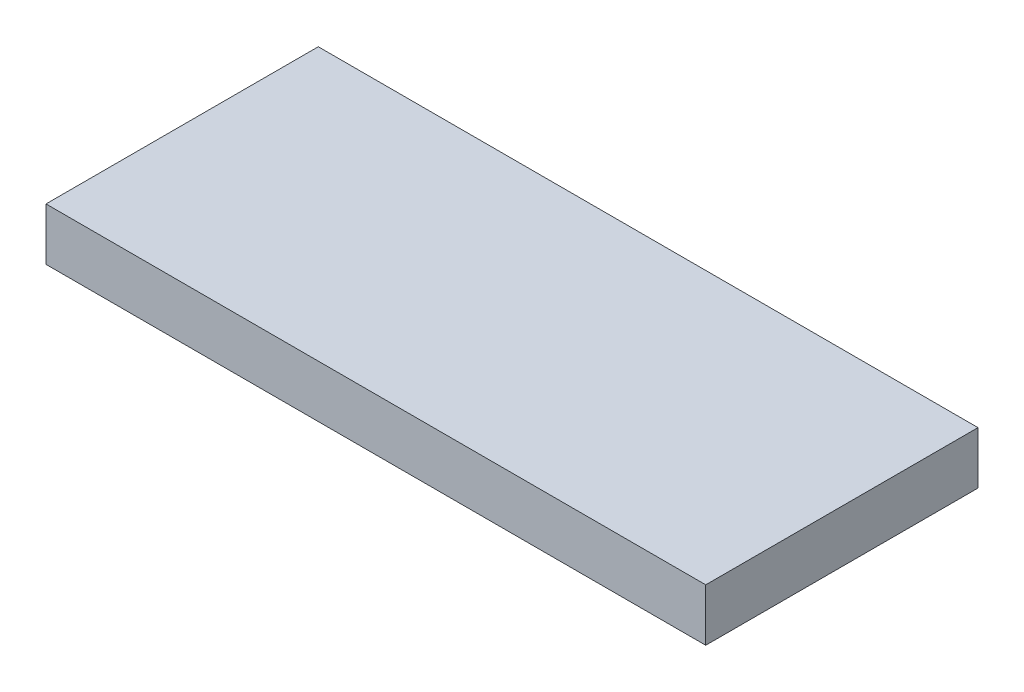
ISO-10303-21;
HEADER;
FILE_DESCRIPTION(('STEP AP214'),'2;1');
FILE_NAME('part.step','',(''),(''),'','','');
FILE_SCHEMA(('AUTOMOTIVE_DESIGN { 1 0 10303 214 1 1 1 1 }'));
ENDSEC;
DATA;
#1=APPLICATION_CONTEXT('core data for automotive mechanical design processes');
#2=APPLICATION_PROTOCOL_DEFINITION('international standard','automotive_design',2000,#1);
#3=PRODUCT_CONTEXT('',#1,'mechanical');
#4=PRODUCT('Part','Part','',(#3));
#5=PRODUCT_RELATED_PRODUCT_CATEGORY('part','',(#4));
#6=PRODUCT_DEFINITION_FORMATION('','',#4);
#7=PRODUCT_DEFINITION_CONTEXT('part definition',#1,'design');
#8=PRODUCT_DEFINITION('design','',#6,#7);
#9=PRODUCT_DEFINITION_SHAPE('','',#8);
#10=(LENGTH_UNIT() NAMED_UNIT(*) SI_UNIT(.MILLI.,.METRE.));
#11=(NAMED_UNIT(*) PLANE_ANGLE_UNIT() SI_UNIT($,.RADIAN.));
#12=(NAMED_UNIT(*) SI_UNIT($,.STERADIAN.) SOLID_ANGLE_UNIT());
#13=UNCERTAINTY_MEASURE_WITH_UNIT(LENGTH_MEASURE(1.E-05),#10,'distance_accuracy_value','');
#14=(GEOMETRIC_REPRESENTATION_CONTEXT(3) GLOBAL_UNCERTAINTY_ASSIGNED_CONTEXT((#13)) GLOBAL_UNIT_ASSIGNED_CONTEXT((#10,
#11,#12)) REPRESENTATION_CONTEXT('',''));
#15=CARTESIAN_POINT('',(0.,0.,0.));
#16=DIRECTION('',(0.,0.,1.));
#17=DIRECTION('',(1.,0.,0.));
#18=AXIS2_PLACEMENT_3D('',#15,#16,#17);
#19=CARTESIAN_POINT('',(0.,5.,0.));
#20=DIRECTION('',(1.,0.,0.));
#21=DIRECTION('',(0.,0.,-1.));
#22=AXIS2_PLACEMENT_3D('',#19,#20,#21);
#23=PLANE('',#22);
#24=DIRECTION('',(0.,0.,1.));
#25=VECTOR('',#24,1.);
#26=CARTESIAN_POINT('',(0.,0.,0.));
#27=LINE('',#26,#25);
#28=CARTESIAN_POINT('',(0.,0.,-26.));
#29=VERTEX_POINT('',#28);
#30=CARTESIAN_POINT('',(0.,0.,0.));
#31=VERTEX_POINT('',#30);
#32=EDGE_CURVE('E106',#29,#31,#27,.T.);
#33=ORIENTED_EDGE('',*,*,#32,.T.);
#34=DIRECTION('',(0.,-1.,0.));
#35=VECTOR('',#34,1.);
#36=CARTESIAN_POINT('',(0.,5.,0.));
#37=LINE('',#36,#35);
#38=CARTESIAN_POINT('',(0.,5.,0.));
#39=VERTEX_POINT('',#38);
#40=EDGE_CURVE('E11',#39,#31,#37,.T.);
#41=ORIENTED_EDGE('',*,*,#40,.F.);
#42=DIRECTION('',(0.,0.,1.));
#43=VECTOR('',#42,1.);
#44=CARTESIAN_POINT('',(0.,5.,0.));
#45=LINE('',#44,#43);
#46=CARTESIAN_POINT('',(0.,5.,-26.));
#47=VERTEX_POINT('',#46);
#48=EDGE_CURVE('E94',#47,#39,#45,.T.);
#49=ORIENTED_EDGE('',*,*,#48,.F.);
#50=DIRECTION('',(0.,-1.,0.));
#51=VECTOR('',#50,1.);
#52=CARTESIAN_POINT('',(0.,5.,-26.));
#53=LINE('',#52,#51);
#54=EDGE_CURVE('E102',#47,#29,#53,.T.);
#55=ORIENTED_EDGE('',*,*,#54,.T.);
#56=EDGE_LOOP('',(#33,#41,#49,#55));
#57=FACE_BOUND('',#56,.T.);
#58=ADVANCED_FACE('F43',(#57),#23,.F.);
#59=CARTESIAN_POINT('',(0.,5.,0.));
#60=DIRECTION('',(0.,0.,-1.));
#61=DIRECTION('',(-1.,0.,0.));
#62=AXIS2_PLACEMENT_3D('',#59,#60,#61);
#63=PLANE('',#62);
#64=DIRECTION('',(1.,0.,0.));
#65=VECTOR('',#64,1.);
#66=CARTESIAN_POINT('',(0.,0.,0.));
#67=LINE('',#66,#65);
#68=CARTESIAN_POINT('',(63.,0.,0.));
#69=VERTEX_POINT('',#68);
#70=EDGE_CURVE('E98',#31,#69,#67,.T.);
#71=ORIENTED_EDGE('',*,*,#70,.T.);
#72=DIRECTION('',(0.,-1.,0.));
#73=VECTOR('',#72,1.);
#74=CARTESIAN_POINT('',(63.,5.,0.));
#75=LINE('',#74,#73);
#76=CARTESIAN_POINT('',(63.,5.,0.));
#77=VERTEX_POINT('',#76);
#78=EDGE_CURVE('E51',#77,#69,#75,.T.);
#79=ORIENTED_EDGE('',*,*,#78,.F.);
#80=DIRECTION('',(1.,0.,0.));
#81=VECTOR('',#80,1.);
#82=CARTESIAN_POINT('',(0.,5.,0.));
#83=LINE('',#82,#81);
#84=EDGE_CURVE('E89',#39,#77,#83,.T.);
#85=ORIENTED_EDGE('',*,*,#84,.F.);
#86=ORIENTED_EDGE('',*,*,#40,.T.);
#87=EDGE_LOOP('',(#71,#79,#85,#86));
#88=FACE_BOUND('',#87,.T.);
#89=ADVANCED_FACE('F97',(#88),#63,.F.);
#90=CARTESIAN_POINT('',(63.,5.,0.));
#91=DIRECTION('',(-1.,0.,0.));
#92=DIRECTION('',(0.,0.,1.));
#93=AXIS2_PLACEMENT_3D('',#90,#91,#92);
#94=PLANE('',#93);
#95=DIRECTION('',(0.,0.,-1.));
#96=VECTOR('',#95,1.);
#97=CARTESIAN_POINT('',(63.,0.,0.));
#98=LINE('',#97,#96);
#99=CARTESIAN_POINT('',(63.,0.,-26.));
#100=VERTEX_POINT('',#99);
#101=EDGE_CURVE('E76',#69,#100,#98,.T.);
#102=ORIENTED_EDGE('',*,*,#101,.T.);
#103=DIRECTION('',(0.,-1.,0.));
#104=VECTOR('',#103,1.);
#105=CARTESIAN_POINT('',(63.,5.,-26.));
#106=LINE('',#105,#104);
#107=CARTESIAN_POINT('',(63.,5.,-26.));
#108=VERTEX_POINT('',#107);
#109=EDGE_CURVE('E99',#108,#100,#106,.T.);
#110=ORIENTED_EDGE('',*,*,#109,.F.);
#111=DIRECTION('',(0.,0.,-1.));
#112=VECTOR('',#111,1.);
#113=CARTESIAN_POINT('',(63.,5.,0.));
#114=LINE('',#113,#112);
#115=EDGE_CURVE('E92',#77,#108,#114,.T.);
#116=ORIENTED_EDGE('',*,*,#115,.F.);
#117=ORIENTED_EDGE('',*,*,#78,.T.);
#118=EDGE_LOOP('',(#102,#110,#116,#117));
#119=FACE_BOUND('',#118,.T.);
#120=ADVANCED_FACE('F100',(#119),#94,.F.);
#121=CARTESIAN_POINT('',(0.,5.,-26.));
#122=DIRECTION('',(0.,0.,1.));
#123=DIRECTION('',(1.,0.,0.));
#124=AXIS2_PLACEMENT_3D('',#121,#122,#123);
#125=PLANE('',#124);
#126=DIRECTION('',(-1.,0.,0.));
#127=VECTOR('',#126,1.);
#128=CARTESIAN_POINT('',(0.,0.,-26.));
#129=LINE('',#128,#127);
#130=EDGE_CURVE('E82',#100,#29,#129,.T.);
#131=ORIENTED_EDGE('',*,*,#130,.T.);
#132=ORIENTED_EDGE('',*,*,#54,.F.);
#133=DIRECTION('',(-1.,0.,0.));
#134=VECTOR('',#133,1.);
#135=CARTESIAN_POINT('',(0.,5.,-26.));
#136=LINE('',#135,#134);
#137=EDGE_CURVE('E59',#108,#47,#136,.T.);
#138=ORIENTED_EDGE('',*,*,#137,.F.);
#139=ORIENTED_EDGE('',*,*,#109,.T.);
#140=EDGE_LOOP('',(#131,#132,#138,#139));
#141=FACE_BOUND('',#140,.T.);
#142=ADVANCED_FACE('F113',(#141),#125,.F.);
#143=CARTESIAN_POINT('',(0.,5.,0.));
#144=DIRECTION('',(0.,-1.,0.));
#145=DIRECTION('',(0.,0.,-1.));
#146=AXIS2_PLACEMENT_3D('',#143,#144,#145);
#147=PLANE('',#146);
#148=ORIENTED_EDGE('',*,*,#48,.T.);
#149=ORIENTED_EDGE('',*,*,#84,.T.);
#150=ORIENTED_EDGE('',*,*,#115,.T.);
#151=ORIENTED_EDGE('',*,*,#137,.T.);
#152=EDGE_LOOP('',(#148,#149,#150,#151));
#153=FACE_BOUND('',#152,.T.);
#154=ADVANCED_FACE('F90',(#153),#147,.F.);
#155=CARTESIAN_POINT('',(0.,0.,0.));
#156=DIRECTION('',(0.,-1.,0.));
#157=DIRECTION('',(0.,0.,-1.));
#158=AXIS2_PLACEMENT_3D('',#155,#156,#157);
#159=PLANE('',#158);
#160=ORIENTED_EDGE('',*,*,#32,.F.);
#161=ORIENTED_EDGE('',*,*,#130,.F.);
#162=ORIENTED_EDGE('',*,*,#101,.F.);
#163=ORIENTED_EDGE('',*,*,#70,.F.);
#164=EDGE_LOOP('',(#160,#161,#162,#163));
#165=FACE_BOUND('',#164,.T.);
#166=ADVANCED_FACE('F116',(#165),#159,.T.);
#167=CLOSED_SHELL('',(#58,#89,#120,#142,#154,#166));
#168=MANIFOLD_SOLID_BREP('B2',#167);
#169=ADVANCED_BREP_SHAPE_REPRESENTATION('',(#18,#168),#14);
#170=SHAPE_DEFINITION_REPRESENTATION(#9,#169);
ENDSEC;
END-ISO-10303-21;
